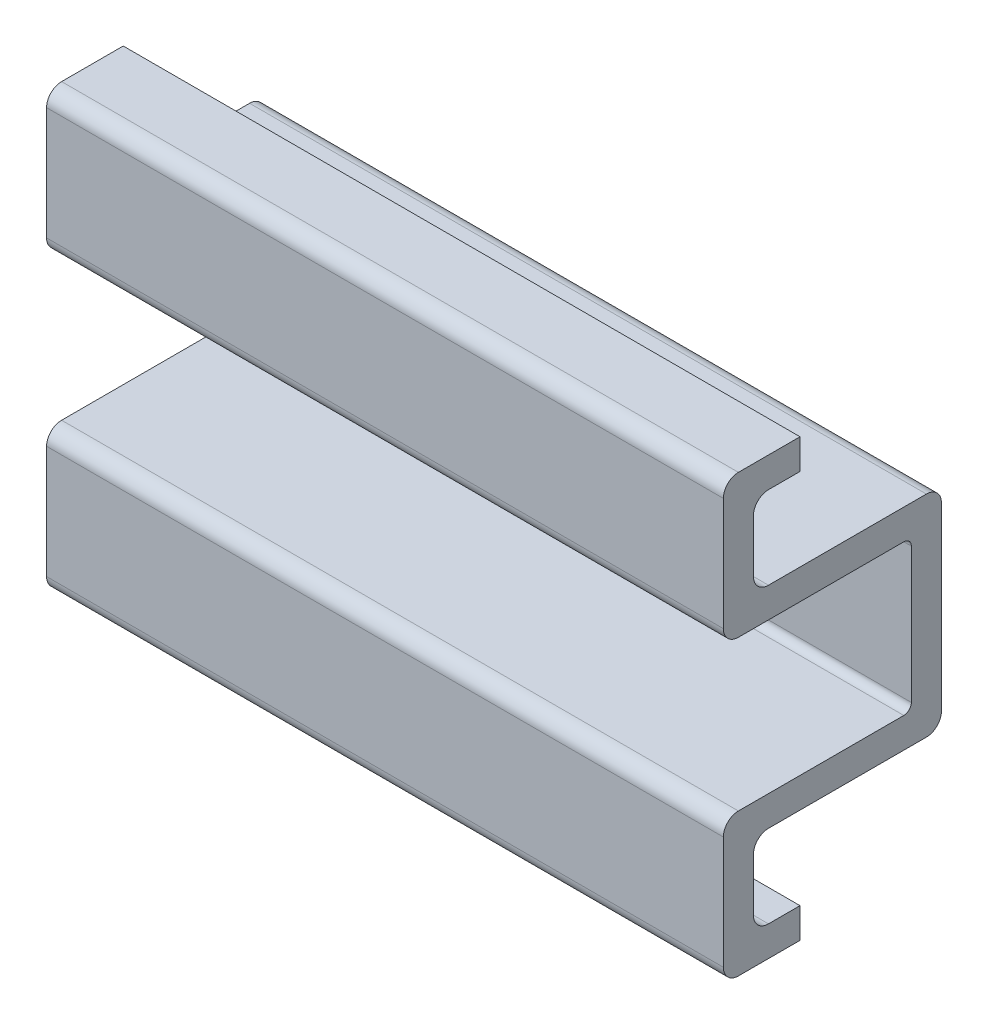
ISO-10303-21;
HEADER;
FILE_DESCRIPTION(('STEP AP214'),'2;1');
FILE_NAME('part.step','',(''),(''),'','','');
FILE_SCHEMA(('AUTOMOTIVE_DESIGN { 1 0 10303 214 1 1 1 1 }'));
ENDSEC;
DATA;
#1=APPLICATION_CONTEXT('core data for automotive mechanical design processes');
#2=APPLICATION_PROTOCOL_DEFINITION('international standard','automotive_design',2000,#1);
#3=PRODUCT_CONTEXT('',#1,'mechanical');
#4=PRODUCT('Part','Part','',(#3));
#5=PRODUCT_RELATED_PRODUCT_CATEGORY('part','',(#4));
#6=PRODUCT_DEFINITION_FORMATION('','',#4);
#7=PRODUCT_DEFINITION_CONTEXT('part definition',#1,'design');
#8=PRODUCT_DEFINITION('design','',#6,#7);
#9=PRODUCT_DEFINITION_SHAPE('','',#8);
#10=(LENGTH_UNIT() NAMED_UNIT(*) SI_UNIT(.MILLI.,.METRE.));
#11=(NAMED_UNIT(*) PLANE_ANGLE_UNIT() SI_UNIT($,.RADIAN.));
#12=(NAMED_UNIT(*) SI_UNIT($,.STERADIAN.) SOLID_ANGLE_UNIT());
#13=UNCERTAINTY_MEASURE_WITH_UNIT(LENGTH_MEASURE(1.E-05),#10,'distance_accuracy_value','');
#14=(GEOMETRIC_REPRESENTATION_CONTEXT(3) GLOBAL_UNCERTAINTY_ASSIGNED_CONTEXT((#13)) GLOBAL_UNIT_ASSIGNED_CONTEXT((#10,
#11,#12)) REPRESENTATION_CONTEXT('',''));
#15=CARTESIAN_POINT('',(0.,0.,0.));
#16=DIRECTION('',(0.,0.,1.));
#17=DIRECTION('',(1.,0.,0.));
#18=AXIS2_PLACEMENT_3D('',#15,#16,#17);
#19=CARTESIAN_POINT('',(45.,0.,13.1316966964459));
#20=DIRECTION('',(0.,0.,1.));
#21=DIRECTION('',(1.,0.,0.));
#22=AXIS2_PLACEMENT_3D('',#19,#20,#21);
#23=PLANE('',#22);
#24=DIRECTION('',(0.,1.,0.));
#25=VECTOR('',#24,1.);
#26=CARTESIAN_POINT('',(0.,0.,13.1316966964459));
#27=LINE('',#26,#25);
#28=CARTESIAN_POINT('',(0.,-14.5,13.1316966964459));
#29=VERTEX_POINT('',#28);
#30=CARTESIAN_POINT('',(0.,-12.5,13.1316966964459));
#31=VERTEX_POINT('',#30);
#32=EDGE_CURVE('E248',#29,#31,#27,.T.);
#33=ORIENTED_EDGE('',*,*,#32,.T.);
#34=DIRECTION('',(-1.,0.,0.));
#35=VECTOR('',#34,1.);
#36=CARTESIAN_POINT('',(45.,-12.5,13.1316966964459));
#37=LINE('',#36,#35);
#38=CARTESIAN_POINT('',(45.,-12.5,13.1316966964459));
#39=VERTEX_POINT('',#38);
#40=EDGE_CURVE('E229',#39,#31,#37,.T.);
#41=ORIENTED_EDGE('',*,*,#40,.F.);
#42=DIRECTION('',(0.,1.,0.));
#43=VECTOR('',#42,1.);
#44=CARTESIAN_POINT('',(45.,0.,13.1316966964459));
#45=LINE('',#44,#43);
#46=CARTESIAN_POINT('',(45.,-14.5,13.1316966964459));
#47=VERTEX_POINT('',#46);
#48=EDGE_CURVE('E235',#47,#39,#45,.T.);
#49=ORIENTED_EDGE('',*,*,#48,.F.);
#50=DIRECTION('',(-1.,0.,0.));
#51=VECTOR('',#50,1.);
#52=CARTESIAN_POINT('',(45.,-14.5,13.1316966964459));
#53=LINE('',#52,#51);
#54=EDGE_CURVE('E387',#47,#29,#53,.T.);
#55=ORIENTED_EDGE('',*,*,#54,.T.);
#56=EDGE_LOOP('',(#33,#41,#49,#55));
#57=FACE_BOUND('',#56,.T.);
#58=ADVANCED_FACE('F40',(#57),#23,.F.);
#59=CARTESIAN_POINT('',(45.,-12.5,0.));
#60=DIRECTION('',(0.,-1.,0.));
#61=DIRECTION('',(0.,0.,-1.));
#62=AXIS2_PLACEMENT_3D('',#59,#60,#61);
#63=PLANE('',#62);
#64=DIRECTION('',(0.,0.,1.));
#65=VECTOR('',#64,1.);
#66=CARTESIAN_POINT('',(0.,-12.5,0.));
#67=LINE('',#66,#65);
#68=CARTESIAN_POINT('',(0.,-12.5,15.2292675484302));
#69=VERTEX_POINT('',#68);
#70=EDGE_CURVE('E389',#31,#69,#67,.T.);
#71=ORIENTED_EDGE('',*,*,#70,.T.);
#72=DIRECTION('',(-1.,0.,0.));
#73=VECTOR('',#72,1.);
#74=CARTESIAN_POINT('',(45.,-12.5,15.2292675484302));
#75=LINE('',#74,#73);
#76=CARTESIAN_POINT('',(45.,-12.5,15.2292675484302));
#77=VERTEX_POINT('',#76);
#78=EDGE_CURVE('E232',#69,#77,#75,.F.);
#79=ORIENTED_EDGE('',*,*,#78,.T.);
#80=DIRECTION('',(0.,0.,1.));
#81=VECTOR('',#80,1.);
#82=CARTESIAN_POINT('',(45.,-12.5,0.));
#83=LINE('',#82,#81);
#84=EDGE_CURVE('E224',#39,#77,#83,.T.);
#85=ORIENTED_EDGE('',*,*,#84,.F.);
#86=ORIENTED_EDGE('',*,*,#40,.T.);
#87=EDGE_LOOP('',(#71,#79,#85,#86));
#88=FACE_BOUND('',#87,.T.);
#89=ADVANCED_FACE('F227',(#88),#63,.F.);
#90=CARTESIAN_POINT('',(45.,0.,16.2292675484302));
#91=DIRECTION('',(0.,0.,-1.));
#92=DIRECTION('',(-1.,0.,0.));
#93=AXIS2_PLACEMENT_3D('',#90,#91,#92);
#94=PLANE('',#93);
#95=DIRECTION('',(0.,-1.,0.));
#96=VECTOR('',#95,1.);
#97=CARTESIAN_POINT('',(45.,0.,16.2292675484302));
#98=LINE('',#97,#96);
#99=CARTESIAN_POINT('',(45.,-8.,16.2292675484302));
#100=VERTEX_POINT('',#99);
#101=CARTESIAN_POINT('',(45.,-11.5,16.2292675484302));
#102=VERTEX_POINT('',#101);
#103=EDGE_CURVE('E234',#100,#102,#98,.T.);
#104=ORIENTED_EDGE('',*,*,#103,.T.);
#105=DIRECTION('',(-1.,0.,0.));
#106=VECTOR('',#105,1.);
#107=CARTESIAN_POINT('',(45.,-11.5,16.2292675484302));
#108=LINE('',#107,#106);
#109=CARTESIAN_POINT('',(0.,-11.5,16.2292675484302));
#110=VERTEX_POINT('',#109);
#111=EDGE_CURVE('E312',#102,#110,#108,.T.);
#112=ORIENTED_EDGE('',*,*,#111,.T.);
#113=DIRECTION('',(0.,-1.,0.));
#114=VECTOR('',#113,1.);
#115=CARTESIAN_POINT('',(0.,0.,16.2292675484302));
#116=LINE('',#115,#114);
#117=CARTESIAN_POINT('',(0.,-8.,16.2292675484302));
#118=VERTEX_POINT('',#117);
#119=EDGE_CURVE('E391',#118,#110,#116,.T.);
#120=ORIENTED_EDGE('',*,*,#119,.F.);
#121=DIRECTION('',(-1.,0.,0.));
#122=VECTOR('',#121,1.);
#123=CARTESIAN_POINT('',(45.,-8.,16.2292675484302));
#124=LINE('',#123,#122);
#125=EDGE_CURVE('E310',#118,#100,#124,.F.);
#126=ORIENTED_EDGE('',*,*,#125,.T.);
#127=EDGE_LOOP('',(#104,#112,#120,#126));
#128=FACE_BOUND('',#127,.T.);
#129=ADVANCED_FACE('F472',(#128),#94,.T.);
#130=CARTESIAN_POINT('',(45.,-7.,0.));
#131=DIRECTION('',(0.,-1.,0.));
#132=DIRECTION('',(0.,0.,-1.));
#133=AXIS2_PLACEMENT_3D('',#130,#131,#132);
#134=PLANE('',#133);
#135=DIRECTION('',(0.,0.,1.));
#136=VECTOR('',#135,1.);
#137=CARTESIAN_POINT('',(45.,-7.,0.));
#138=LINE('',#137,#136);
#139=CARTESIAN_POINT('',(45.,-7.,4.72926754843017));
#140=VERTEX_POINT('',#139);
#141=CARTESIAN_POINT('',(45.,-7.,15.2292675484302));
#142=VERTEX_POINT('',#141);
#143=EDGE_CURVE('E465',#140,#142,#138,.T.);
#144=ORIENTED_EDGE('',*,*,#143,.T.);
#145=DIRECTION('',(-1.,0.,0.));
#146=VECTOR('',#145,1.);
#147=CARTESIAN_POINT('',(0.,-7.,15.2292675484302));
#148=LINE('',#147,#146);
#149=CARTESIAN_POINT('',(0.,-7.,15.2292675484302));
#150=VERTEX_POINT('',#149);
#151=EDGE_CURVE('E318',#142,#150,#148,.T.);
#152=ORIENTED_EDGE('',*,*,#151,.T.);
#153=DIRECTION('',(0.,0.,1.));
#154=VECTOR('',#153,1.);
#155=CARTESIAN_POINT('',(0.,-7.,0.));
#156=LINE('',#155,#154);
#157=CARTESIAN_POINT('',(0.,-7.,4.72926754843017));
#158=VERTEX_POINT('',#157);
#159=EDGE_CURVE('E394',#158,#150,#156,.T.);
#160=ORIENTED_EDGE('',*,*,#159,.F.);
#161=DIRECTION('',(-1.,0.,0.));
#162=VECTOR('',#161,1.);
#163=CARTESIAN_POINT('',(45.,-7.,4.72926754843017));
#164=LINE('',#163,#162);
#165=EDGE_CURVE('E316',#158,#140,#164,.F.);
#166=ORIENTED_EDGE('',*,*,#165,.T.);
#167=EDGE_LOOP('',(#144,#152,#160,#166));
#168=FACE_BOUND('',#167,.T.);
#169=ADVANCED_FACE('F484',(#168),#134,.T.);
#170=CARTESIAN_POINT('',(45.,0.,3.72926754843018));
#171=DIRECTION('',(0.,0.,-1.));
#172=DIRECTION('',(0.,1.,0.));
#173=AXIS2_PLACEMENT_3D('',#170,#171,#172);
#174=PLANE('',#173);
#175=DIRECTION('',(0.,-1.,0.));
#176=VECTOR('',#175,1.);
#177=CARTESIAN_POINT('',(0.,0.,3.72926754843018));
#178=LINE('',#177,#176);
#179=CARTESIAN_POINT('',(0.,6.,3.72926754843018));
#180=VERTEX_POINT('',#179);
#181=CARTESIAN_POINT('',(0.,-6.,3.72926754843017));
#182=VERTEX_POINT('',#181);
#183=EDGE_CURVE('E397',#180,#182,#178,.T.);
#184=ORIENTED_EDGE('',*,*,#183,.F.);
#185=DIRECTION('',(-1.,0.,0.));
#186=VECTOR('',#185,1.);
#187=CARTESIAN_POINT('',(45.,6.,3.72926754843018));
#188=LINE('',#187,#186);
#189=CARTESIAN_POINT('',(45.,6.,3.72926754843018));
#190=VERTEX_POINT('',#189);
#191=EDGE_CURVE('E329',#180,#190,#188,.F.);
#192=ORIENTED_EDGE('',*,*,#191,.T.);
#193=DIRECTION('',(0.,-1.,0.));
#194=VECTOR('',#193,1.);
#195=CARTESIAN_POINT('',(45.,0.,3.72926754843018));
#196=LINE('',#195,#194);
#197=CARTESIAN_POINT('',(45.,-6.,3.72926754843017));
#198=VERTEX_POINT('',#197);
#199=EDGE_CURVE('E462',#190,#198,#196,.T.);
#200=ORIENTED_EDGE('',*,*,#199,.T.);
#201=DIRECTION('',(-1.,0.,0.));
#202=VECTOR('',#201,1.);
#203=CARTESIAN_POINT('',(45.,-6.,3.72926754843017));
#204=LINE('',#203,#202);
#205=EDGE_CURVE('E326',#198,#182,#204,.T.);
#206=ORIENTED_EDGE('',*,*,#205,.T.);
#207=EDGE_LOOP('',(#184,#192,#200,#206));
#208=FACE_BOUND('',#207,.T.);
#209=ADVANCED_FACE('F494',(#208),#174,.T.);
#210=CARTESIAN_POINT('',(45.,7.,0.));
#211=DIRECTION('',(0.,-1.,0.));
#212=DIRECTION('',(0.,0.,-1.));
#213=AXIS2_PLACEMENT_3D('',#210,#211,#212);
#214=PLANE('',#213);
#215=DIRECTION('',(0.,0.,1.));
#216=VECTOR('',#215,1.);
#217=CARTESIAN_POINT('',(0.,7.,0.));
#218=LINE('',#217,#216);
#219=CARTESIAN_POINT('',(0.,7.,4.72926754843018));
#220=VERTEX_POINT('',#219);
#221=CARTESIAN_POINT('',(0.,7.,15.2292675484302));
#222=VERTEX_POINT('',#221);
#223=EDGE_CURVE('E400',#220,#222,#218,.T.);
#224=ORIENTED_EDGE('',*,*,#223,.T.);
#225=DIRECTION('',(-1.,0.,0.));
#226=VECTOR('',#225,1.);
#227=CARTESIAN_POINT('',(45.,7.,15.2292675484302));
#228=LINE('',#227,#226);
#229=CARTESIAN_POINT('',(45.,7.,15.2292675484302));
#230=VERTEX_POINT('',#229);
#231=EDGE_CURVE('E324',#222,#230,#228,.F.);
#232=ORIENTED_EDGE('',*,*,#231,.T.);
#233=DIRECTION('',(0.,0.,1.));
#234=VECTOR('',#233,1.);
#235=CARTESIAN_POINT('',(45.,7.,0.));
#236=LINE('',#235,#234);
#237=CARTESIAN_POINT('',(45.,7.,4.72926754843018));
#238=VERTEX_POINT('',#237);
#239=EDGE_CURVE('E459',#238,#230,#236,.T.);
#240=ORIENTED_EDGE('',*,*,#239,.F.);
#241=DIRECTION('',(-1.,0.,0.));
#242=VECTOR('',#241,1.);
#243=CARTESIAN_POINT('',(0.,7.,4.72926754843018));
#244=LINE('',#243,#242);
#245=EDGE_CURVE('E321',#238,#220,#244,.T.);
#246=ORIENTED_EDGE('',*,*,#245,.T.);
#247=EDGE_LOOP('',(#224,#232,#240,#246));
#248=FACE_BOUND('',#247,.T.);
#249=ADVANCED_FACE('F502',(#248),#214,.F.);
#250=CARTESIAN_POINT('',(45.,0.,16.2292675484302));
#251=DIRECTION('',(0.,0.,1.));
#252=DIRECTION('',(1.,0.,0.));
#253=AXIS2_PLACEMENT_3D('',#250,#251,#252);
#254=PLANE('',#253);
#255=DIRECTION('',(0.,1.,0.));
#256=VECTOR('',#255,1.);
#257=CARTESIAN_POINT('',(0.,0.,16.2292675484302));
#258=LINE('',#257,#256);
#259=CARTESIAN_POINT('',(0.,8.,16.2292675484302));
#260=VERTEX_POINT('',#259);
#261=CARTESIAN_POINT('',(0.,11.5,16.2292675484302));
#262=VERTEX_POINT('',#261);
#263=EDGE_CURVE('E403',#260,#262,#258,.T.);
#264=ORIENTED_EDGE('',*,*,#263,.T.);
#265=DIRECTION('',(-1.,0.,0.));
#266=VECTOR('',#265,1.);
#267=CARTESIAN_POINT('',(45.,11.5,16.2292675484302));
#268=LINE('',#267,#266);
#269=CARTESIAN_POINT('',(45.,11.5,16.2292675484302));
#270=VERTEX_POINT('',#269);
#271=EDGE_CURVE('E308',#262,#270,#268,.F.);
#272=ORIENTED_EDGE('',*,*,#271,.T.);
#273=DIRECTION('',(0.,1.,0.));
#274=VECTOR('',#273,1.);
#275=CARTESIAN_POINT('',(45.,0.,16.2292675484302));
#276=LINE('',#275,#274);
#277=CARTESIAN_POINT('',(45.,8.,16.2292675484302));
#278=VERTEX_POINT('',#277);
#279=EDGE_CURVE('E456',#278,#270,#276,.T.);
#280=ORIENTED_EDGE('',*,*,#279,.F.);
#281=DIRECTION('',(-1.,0.,0.));
#282=VECTOR('',#281,1.);
#283=CARTESIAN_POINT('',(0.,8.,16.2292675484302));
#284=LINE('',#283,#282);
#285=EDGE_CURVE('E305',#278,#260,#284,.T.);
#286=ORIENTED_EDGE('',*,*,#285,.T.);
#287=EDGE_LOOP('',(#264,#272,#280,#286));
#288=FACE_BOUND('',#287,.T.);
#289=ADVANCED_FACE('F511',(#288),#254,.F.);
#290=CARTESIAN_POINT('',(45.,12.5,0.));
#291=DIRECTION('',(0.,-1.,0.));
#292=DIRECTION('',(0.,0.,-1.));
#293=AXIS2_PLACEMENT_3D('',#290,#291,#292);
#294=PLANE('',#293);
#295=DIRECTION('',(0.,0.,1.));
#296=VECTOR('',#295,1.);
#297=CARTESIAN_POINT('',(45.,12.5,0.));
#298=LINE('',#297,#296);
#299=CARTESIAN_POINT('',(45.,12.5,13.1316966964459));
#300=VERTEX_POINT('',#299);
#301=CARTESIAN_POINT('',(45.,12.5,15.2292675484302));
#302=VERTEX_POINT('',#301);
#303=EDGE_CURVE('E453',#300,#302,#298,.T.);
#304=ORIENTED_EDGE('',*,*,#303,.T.);
#305=DIRECTION('',(-1.,0.,0.));
#306=VECTOR('',#305,1.);
#307=CARTESIAN_POINT('',(45.,12.5,15.2292675484302));
#308=LINE('',#307,#306);
#309=CARTESIAN_POINT('',(0.,12.5,15.2292675484302));
#310=VERTEX_POINT('',#309);
#311=EDGE_CURVE('E302',#302,#310,#308,.T.);
#312=ORIENTED_EDGE('',*,*,#311,.T.);
#313=DIRECTION('',(0.,0.,1.));
#314=VECTOR('',#313,1.);
#315=CARTESIAN_POINT('',(0.,12.5,0.));
#316=LINE('',#315,#314);
#317=CARTESIAN_POINT('',(0.,12.5,13.1316966964459));
#318=VERTEX_POINT('',#317);
#319=EDGE_CURVE('E406',#318,#310,#316,.T.);
#320=ORIENTED_EDGE('',*,*,#319,.F.);
#321=DIRECTION('',(-1.,0.,0.));
#322=VECTOR('',#321,1.);
#323=CARTESIAN_POINT('',(45.,12.5,13.1316966964459));
#324=LINE('',#323,#322);
#325=EDGE_CURVE('E250',#300,#318,#324,.T.);
#326=ORIENTED_EDGE('',*,*,#325,.F.);
#327=EDGE_LOOP('',(#304,#312,#320,#326));
#328=FACE_BOUND('',#327,.T.);
#329=ADVANCED_FACE('F519',(#328),#294,.T.);
#330=CARTESIAN_POINT('',(45.,0.,13.1316966964459));
#331=DIRECTION('',(0.,0.,-1.));
#332=DIRECTION('',(-1.,0.,0.));
#333=AXIS2_PLACEMENT_3D('',#330,#331,#332);
#334=PLANE('',#333);
#335=DIRECTION('',(0.,-1.,0.));
#336=VECTOR('',#335,1.);
#337=CARTESIAN_POINT('',(0.,0.,13.1316966964459));
#338=LINE('',#337,#336);
#339=CARTESIAN_POINT('',(0.,14.5,13.1316966964459));
#340=VERTEX_POINT('',#339);
#341=EDGE_CURVE('E409',#340,#318,#338,.T.);
#342=ORIENTED_EDGE('',*,*,#341,.F.);
#343=DIRECTION('',(-1.,0.,0.));
#344=VECTOR('',#343,1.);
#345=CARTESIAN_POINT('',(45.,14.5,13.1316966964459));
#346=LINE('',#345,#344);
#347=CARTESIAN_POINT('',(45.,14.5,13.1316966964459));
#348=VERTEX_POINT('',#347);
#349=EDGE_CURVE('E255',#348,#340,#346,.T.);
#350=ORIENTED_EDGE('',*,*,#349,.F.);
#351=DIRECTION('',(0.,-1.,0.));
#352=VECTOR('',#351,1.);
#353=CARTESIAN_POINT('',(45.,0.,13.1316966964459));
#354=LINE('',#353,#352);
#355=EDGE_CURVE('E449',#348,#300,#354,.T.);
#356=ORIENTED_EDGE('',*,*,#355,.T.);
#357=ORIENTED_EDGE('',*,*,#325,.T.);
#358=EDGE_LOOP('',(#342,#350,#356,#357));
#359=FACE_BOUND('',#358,.T.);
#360=ADVANCED_FACE('F435',(#359),#334,.T.);
#361=CARTESIAN_POINT('',(45.,14.5,0.));
#362=DIRECTION('',(0.,1.,0.));
#363=DIRECTION('',(0.,0.,1.));
#364=AXIS2_PLACEMENT_3D('',#361,#362,#363);
#365=PLANE('',#364);
#366=DIRECTION('',(0.,0.,-1.));
#367=VECTOR('',#366,1.);
#368=CARTESIAN_POINT('',(0.,14.5,0.));
#369=LINE('',#368,#367);
#370=CARTESIAN_POINT('',(0.,14.5,17.2292675484302));
#371=VERTEX_POINT('',#370);
#372=EDGE_CURVE('E412',#371,#340,#369,.T.);
#373=ORIENTED_EDGE('',*,*,#372,.F.);
#374=DIRECTION('',(-1.,0.,0.));
#375=VECTOR('',#374,1.);
#376=CARTESIAN_POINT('',(45.,14.5,17.2292675484302));
#377=LINE('',#376,#375);
#378=CARTESIAN_POINT('',(45.,14.5,17.2292675484302));
#379=VERTEX_POINT('',#378);
#380=EDGE_CURVE('E300',#371,#379,#377,.F.);
#381=ORIENTED_EDGE('',*,*,#380,.T.);
#382=DIRECTION('',(0.,0.,-1.));
#383=VECTOR('',#382,1.);
#384=CARTESIAN_POINT('',(45.,14.5,0.));
#385=LINE('',#384,#383);
#386=EDGE_CURVE('E431',#379,#348,#385,.T.);
#387=ORIENTED_EDGE('',*,*,#386,.T.);
#388=ORIENTED_EDGE('',*,*,#349,.T.);
#389=EDGE_LOOP('',(#373,#381,#387,#388));
#390=FACE_BOUND('',#389,.T.);
#391=ADVANCED_FACE('F428',(#390),#365,.T.);
#392=CARTESIAN_POINT('',(45.,0.,18.2292675484302));
#393=DIRECTION('',(0.,0.,1.));
#394=DIRECTION('',(1.,0.,0.));
#395=AXIS2_PLACEMENT_3D('',#392,#393,#394);
#396=PLANE('',#395);
#397=DIRECTION('',(0.,1.,0.));
#398=VECTOR('',#397,1.);
#399=CARTESIAN_POINT('',(0.,0.,18.2292675484302));
#400=LINE('',#399,#398);
#401=CARTESIAN_POINT('',(0.,6.,18.2292675484302));
#402=VERTEX_POINT('',#401);
#403=CARTESIAN_POINT('',(0.,13.5,18.2292675484302));
#404=VERTEX_POINT('',#403);
#405=EDGE_CURVE('E414',#402,#404,#400,.T.);
#406=ORIENTED_EDGE('',*,*,#405,.F.);
#407=DIRECTION('',(-1.,0.,0.));
#408=VECTOR('',#407,1.);
#409=CARTESIAN_POINT('',(45.,6.,18.2292675484302));
#410=LINE('',#409,#408);
#411=CARTESIAN_POINT('',(45.,6.,18.2292675484302));
#412=VERTEX_POINT('',#411);
#413=EDGE_CURVE('E274',#402,#412,#410,.F.);
#414=ORIENTED_EDGE('',*,*,#413,.T.);
#415=DIRECTION('',(0.,1.,0.));
#416=VECTOR('',#415,1.);
#417=CARTESIAN_POINT('',(45.,0.,18.2292675484302));
#418=LINE('',#417,#416);
#419=CARTESIAN_POINT('',(45.,13.5,18.2292675484302));
#420=VERTEX_POINT('',#419);
#421=EDGE_CURVE('E446',#412,#420,#418,.T.);
#422=ORIENTED_EDGE('',*,*,#421,.T.);
#423=DIRECTION('',(-1.,0.,0.));
#424=VECTOR('',#423,1.);
#425=CARTESIAN_POINT('',(45.,13.5,18.2292675484302));
#426=LINE('',#425,#424);
#427=EDGE_CURVE('E271',#420,#404,#426,.T.);
#428=ORIENTED_EDGE('',*,*,#427,.T.);
#429=EDGE_LOOP('',(#406,#414,#422,#428));
#430=FACE_BOUND('',#429,.T.);
#431=ADVANCED_FACE('F444',(#430),#396,.T.);
#432=CARTESIAN_POINT('',(45.,5.,0.));
#433=DIRECTION('',(0.,-1.,0.));
#434=DIRECTION('',(0.,0.,-1.));
#435=AXIS2_PLACEMENT_3D('',#432,#433,#434);
#436=PLANE('',#435);
#437=DIRECTION('',(0.,0.,1.));
#438=VECTOR('',#437,1.);
#439=CARTESIAN_POINT('',(0.,5.,0.));
#440=LINE('',#439,#438);
#441=CARTESIAN_POINT('',(0.,5.,6.22926754843018));
#442=VERTEX_POINT('',#441);
#443=CARTESIAN_POINT('',(0.,5.,17.2292675484302));
#444=VERTEX_POINT('',#443);
#445=EDGE_CURVE('E370',#442,#444,#440,.T.);
#446=ORIENTED_EDGE('',*,*,#445,.F.);
#447=DIRECTION('',(-1.,0.,0.));
#448=VECTOR('',#447,1.);
#449=CARTESIAN_POINT('',(45.,5.,6.22926754843018));
#450=LINE('',#449,#448);
#451=CARTESIAN_POINT('',(45.,5.,6.22926754843018));
#452=VERTEX_POINT('',#451);
#453=EDGE_CURVE('E352',#442,#452,#450,.F.);
#454=ORIENTED_EDGE('',*,*,#453,.T.);
#455=DIRECTION('',(0.,0.,1.));
#456=VECTOR('',#455,1.);
#457=CARTESIAN_POINT('',(45.,5.,0.));
#458=LINE('',#457,#456);
#459=CARTESIAN_POINT('',(45.,5.,17.2292675484302));
#460=VERTEX_POINT('',#459);
#461=EDGE_CURVE('E382',#452,#460,#458,.T.);
#462=ORIENTED_EDGE('',*,*,#461,.T.);
#463=DIRECTION('',(-1.,0.,0.));
#464=VECTOR('',#463,1.);
#465=CARTESIAN_POINT('',(45.,5.,17.2292675484302));
#466=LINE('',#465,#464);
#467=EDGE_CURVE('E249',#460,#444,#466,.T.);
#468=ORIENTED_EDGE('',*,*,#467,.T.);
#469=EDGE_LOOP('',(#446,#454,#462,#468));
#470=FACE_BOUND('',#469,.T.);
#471=ADVANCED_FACE('F575',(#470),#436,.T.);
#472=CARTESIAN_POINT('',(45.,0.,5.72926754843018));
#473=DIRECTION('',(0.,0.,-1.));
#474=DIRECTION('',(0.,1.,0.));
#475=AXIS2_PLACEMENT_3D('',#472,#473,#474);
#476=PLANE('',#475);
#477=DIRECTION('',(0.,-1.,0.));
#478=VECTOR('',#477,1.);
#479=CARTESIAN_POINT('',(45.,0.,5.72926754843018));
#480=LINE('',#479,#478);
#481=CARTESIAN_POINT('',(45.,4.5,5.72926754843018));
#482=VERTEX_POINT('',#481);
#483=CARTESIAN_POINT('',(45.,-4.5,5.72926754843017));
#484=VERTEX_POINT('',#483);
#485=EDGE_CURVE('E378',#482,#484,#480,.T.);
#486=ORIENTED_EDGE('',*,*,#485,.F.);
#487=DIRECTION('',(-1.,0.,0.));
#488=VECTOR('',#487,1.);
#489=CARTESIAN_POINT('',(45.,4.5,5.72926754843018));
#490=LINE('',#489,#488);
#491=CARTESIAN_POINT('',(0.,4.5,5.72926754843018));
#492=VERTEX_POINT('',#491);
#493=EDGE_CURVE('E349',#482,#492,#490,.T.);
#494=ORIENTED_EDGE('',*,*,#493,.T.);
#495=DIRECTION('',(0.,-1.,0.));
#496=VECTOR('',#495,1.);
#497=CARTESIAN_POINT('',(0.,0.,5.72926754843018));
#498=LINE('',#497,#496);
#499=CARTESIAN_POINT('',(0.,-4.5,5.72926754843017));
#500=VERTEX_POINT('',#499);
#501=EDGE_CURVE('E364',#492,#500,#498,.T.);
#502=ORIENTED_EDGE('',*,*,#501,.T.);
#503=DIRECTION('',(-1.,0.,0.));
#504=VECTOR('',#503,1.);
#505=CARTESIAN_POINT('',(45.,-4.5,5.72926754843017));
#506=LINE('',#505,#504);
#507=EDGE_CURVE('E347',#500,#484,#506,.F.);
#508=ORIENTED_EDGE('',*,*,#507,.T.);
#509=EDGE_LOOP('',(#486,#494,#502,#508));
#510=FACE_BOUND('',#509,.T.);
#511=ADVANCED_FACE('F368',(#510),#476,.F.);
#512=CARTESIAN_POINT('',(45.,-5.,0.));
#513=DIRECTION('',(0.,-1.,0.));
#514=DIRECTION('',(0.,0.,-1.));
#515=AXIS2_PLACEMENT_3D('',#512,#513,#514);
#516=PLANE('',#515);
#517=DIRECTION('',(0.,0.,1.));
#518=VECTOR('',#517,1.);
#519=CARTESIAN_POINT('',(45.,-5.,0.));
#520=LINE('',#519,#518);
#521=CARTESIAN_POINT('',(45.,-5.,6.22926754843017));
#522=VERTEX_POINT('',#521);
#523=CARTESIAN_POINT('',(45.,-5.,17.2292675484302));
#524=VERTEX_POINT('',#523);
#525=EDGE_CURVE('E374',#522,#524,#520,.T.);
#526=ORIENTED_EDGE('',*,*,#525,.F.);
#527=DIRECTION('',(-1.,0.,0.));
#528=VECTOR('',#527,1.);
#529=CARTESIAN_POINT('',(0.,-5.,6.22926754843017));
#530=LINE('',#529,#528);
#531=CARTESIAN_POINT('',(0.,-5.,6.22926754843017));
#532=VERTEX_POINT('',#531);
#533=EDGE_CURVE('E354',#522,#532,#530,.T.);
#534=ORIENTED_EDGE('',*,*,#533,.T.);
#535=DIRECTION('',(0.,0.,1.));
#536=VECTOR('',#535,1.);
#537=CARTESIAN_POINT('',(0.,-5.,0.));
#538=LINE('',#537,#536);
#539=CARTESIAN_POINT('',(0.,-5.,17.2292675484302));
#540=VERTEX_POINT('',#539);
#541=EDGE_CURVE('E365',#532,#540,#538,.T.);
#542=ORIENTED_EDGE('',*,*,#541,.T.);
#543=DIRECTION('',(-1.,0.,0.));
#544=VECTOR('',#543,1.);
#545=CARTESIAN_POINT('',(45.,-5.,17.2292675484302));
#546=LINE('',#545,#544);
#547=EDGE_CURVE('E294',#540,#524,#546,.F.);
#548=ORIENTED_EDGE('',*,*,#547,.T.);
#549=EDGE_LOOP('',(#526,#534,#542,#548));
#550=FACE_BOUND('',#549,.T.);
#551=ADVANCED_FACE('F373',(#550),#516,.F.);
#552=CARTESIAN_POINT('',(45.,0.,18.2292675484302));
#553=DIRECTION('',(0.,0.,-1.));
#554=DIRECTION('',(-1.,0.,0.));
#555=AXIS2_PLACEMENT_3D('',#552,#553,#554);
#556=PLANE('',#555);
#557=DIRECTION('',(0.,-1.,0.));
#558=VECTOR('',#557,1.);
#559=CARTESIAN_POINT('',(45.,0.,18.2292675484302));
#560=LINE('',#559,#558);
#561=CARTESIAN_POINT('',(45.,-6.,18.2292675484302));
#562=VERTEX_POINT('',#561);
#563=CARTESIAN_POINT('',(45.,-13.5,18.2292675484302));
#564=VERTEX_POINT('',#563);
#565=EDGE_CURVE('E377',#562,#564,#560,.T.);
#566=ORIENTED_EDGE('',*,*,#565,.F.);
#567=DIRECTION('',(-1.,0.,0.));
#568=VECTOR('',#567,1.);
#569=CARTESIAN_POINT('',(45.,-6.,18.2292675484302));
#570=LINE('',#569,#568);
#571=CARTESIAN_POINT('',(0.,-6.,18.2292675484302));
#572=VERTEX_POINT('',#571);
#573=EDGE_CURVE('E291',#562,#572,#570,.T.);
#574=ORIENTED_EDGE('',*,*,#573,.T.);
#575=DIRECTION('',(0.,-1.,0.));
#576=VECTOR('',#575,1.);
#577=CARTESIAN_POINT('',(0.,0.,18.2292675484302));
#578=LINE('',#577,#576);
#579=CARTESIAN_POINT('',(0.,-13.5,18.2292675484302));
#580=VERTEX_POINT('',#579);
#581=EDGE_CURVE('E419',#572,#580,#578,.T.);
#582=ORIENTED_EDGE('',*,*,#581,.T.);
#583=DIRECTION('',(-1.,0.,0.));
#584=VECTOR('',#583,1.);
#585=CARTESIAN_POINT('',(45.,-13.5,18.2292675484302));
#586=LINE('',#585,#584);
#587=EDGE_CURVE('E289',#580,#564,#586,.F.);
#588=ORIENTED_EDGE('',*,*,#587,.T.);
#589=EDGE_LOOP('',(#566,#574,#582,#588));
#590=FACE_BOUND('',#589,.T.);
#591=ADVANCED_FACE('F597',(#590),#556,.F.);
#592=CARTESIAN_POINT('',(45.,-14.5,0.));
#593=DIRECTION('',(0.,1.,0.));
#594=DIRECTION('',(0.,0.,1.));
#595=AXIS2_PLACEMENT_3D('',#592,#593,#594);
#596=PLANE('',#595);
#597=DIRECTION('',(0.,0.,-1.));
#598=VECTOR('',#597,1.);
#599=CARTESIAN_POINT('',(45.,-14.5,0.));
#600=LINE('',#599,#598);
#601=CARTESIAN_POINT('',(45.,-14.5,17.2292675484302));
#602=VERTEX_POINT('',#601);
#603=EDGE_CURVE('E241',#602,#47,#600,.T.);
#604=ORIENTED_EDGE('',*,*,#603,.F.);
#605=DIRECTION('',(-1.,0.,0.));
#606=VECTOR('',#605,1.);
#607=CARTESIAN_POINT('',(45.,-14.5,17.2292675484302));
#608=LINE('',#607,#606);
#609=CARTESIAN_POINT('',(0.,-14.5,17.2292675484302));
#610=VERTEX_POINT('',#609);
#611=EDGE_CURVE('E297',#602,#610,#608,.T.);
#612=ORIENTED_EDGE('',*,*,#611,.T.);
#613=DIRECTION('',(0.,0.,-1.));
#614=VECTOR('',#613,1.);
#615=CARTESIAN_POINT('',(0.,-14.5,0.));
#616=LINE('',#615,#614);
#617=EDGE_CURVE('E245',#610,#29,#616,.T.);
#618=ORIENTED_EDGE('',*,*,#617,.T.);
#619=ORIENTED_EDGE('',*,*,#54,.F.);
#620=EDGE_LOOP('',(#604,#612,#618,#619));
#621=FACE_BOUND('',#620,.T.);
#622=ADVANCED_FACE('F601',(#621),#596,.F.);
#623=CARTESIAN_POINT('',(45.,0.,0.));
#624=DIRECTION('',(1.,0.,0.));
#625=DIRECTION('',(0.,0.,-1.));
#626=AXIS2_PLACEMENT_3D('',#623,#624,#625);
#627=PLANE('',#626);
#628=ORIENTED_EDGE('',*,*,#421,.F.);
#629=CARTESIAN_POINT('',(45.,6.,17.2292675484302));
#630=DIRECTION('',(1.,0.,0.));
#631=DIRECTION('',(0.,0.,-1.));
#632=AXIS2_PLACEMENT_3D('',#629,#630,#631);
#633=CIRCLE('',#632,1.);
#634=EDGE_CURVE('E286',#412,#460,#633,.T.);
#635=ORIENTED_EDGE('',*,*,#634,.T.);
#636=ORIENTED_EDGE('',*,*,#461,.F.);
#637=CARTESIAN_POINT('',(45.,4.5,6.22926754843018));
#638=DIRECTION('',(1.,0.,0.));
#639=DIRECTION('',(0.,0.,-1.));
#640=AXIS2_PLACEMENT_3D('',#637,#638,#639);
#641=CIRCLE('',#640,0.5);
#642=EDGE_CURVE('E358',#452,#482,#641,.F.);
#643=ORIENTED_EDGE('',*,*,#642,.T.);
#644=ORIENTED_EDGE('',*,*,#485,.T.);
#645=CARTESIAN_POINT('',(45.,-4.5,6.22926754843017));
#646=DIRECTION('',(1.,0.,0.));
#647=DIRECTION('',(0.,0.,-1.));
#648=AXIS2_PLACEMENT_3D('',#645,#646,#647);
#649=CIRCLE('',#648,0.5);
#650=EDGE_CURVE('E11',#484,#522,#649,.F.);
#651=ORIENTED_EDGE('',*,*,#650,.T.);
#652=ORIENTED_EDGE('',*,*,#525,.T.);
#653=CARTESIAN_POINT('',(45.,-6.,17.2292675484302));
#654=DIRECTION('',(1.,0.,0.));
#655=DIRECTION('',(0.,0.,-1.));
#656=AXIS2_PLACEMENT_3D('',#653,#654,#655);
#657=CIRCLE('',#656,1.);
#658=EDGE_CURVE('E284',#524,#562,#657,.T.);
#659=ORIENTED_EDGE('',*,*,#658,.T.);
#660=ORIENTED_EDGE('',*,*,#565,.T.);
#661=CARTESIAN_POINT('',(45.,-13.5,17.2292675484302));
#662=DIRECTION('',(1.,0.,0.));
#663=DIRECTION('',(0.,0.,-1.));
#664=AXIS2_PLACEMENT_3D('',#661,#662,#663);
#665=CIRCLE('',#664,1.);
#666=EDGE_CURVE('E282',#564,#602,#665,.T.);
#667=ORIENTED_EDGE('',*,*,#666,.T.);
#668=ORIENTED_EDGE('',*,*,#603,.T.);
#669=ORIENTED_EDGE('',*,*,#48,.T.);
#670=ORIENTED_EDGE('',*,*,#84,.T.);
#671=CARTESIAN_POINT('',(45.,-11.5,15.2292675484302));
#672=DIRECTION('',(1.,0.,0.));
#673=DIRECTION('',(0.,0.,-1.));
#674=AXIS2_PLACEMENT_3D('',#671,#672,#673);
#675=CIRCLE('',#674,1.);
#676=EDGE_CURVE('E337',#77,#102,#675,.F.);
#677=ORIENTED_EDGE('',*,*,#676,.T.);
#678=ORIENTED_EDGE('',*,*,#103,.F.);
#679=CARTESIAN_POINT('',(45.,-8.,15.2292675484302));
#680=DIRECTION('',(1.,0.,0.));
#681=DIRECTION('',(0.,0.,-1.));
#682=AXIS2_PLACEMENT_3D('',#679,#680,#681);
#683=CIRCLE('',#682,1.);
#684=EDGE_CURVE('E341',#100,#142,#683,.F.);
#685=ORIENTED_EDGE('',*,*,#684,.T.);
#686=ORIENTED_EDGE('',*,*,#143,.F.);
#687=CARTESIAN_POINT('',(45.,-6.,4.72926754843017));
#688=DIRECTION('',(1.,0.,0.));
#689=DIRECTION('',(0.,0.,-1.));
#690=AXIS2_PLACEMENT_3D('',#687,#688,#689);
#691=CIRCLE('',#690,1.);
#692=EDGE_CURVE('E276',#140,#198,#691,.T.);
#693=ORIENTED_EDGE('',*,*,#692,.T.);
#694=ORIENTED_EDGE('',*,*,#199,.F.);
#695=CARTESIAN_POINT('',(45.,6.,4.72926754843018));
#696=DIRECTION('',(1.,0.,0.));
#697=DIRECTION('',(0.,0.,-1.));
#698=AXIS2_PLACEMENT_3D('',#695,#696,#697);
#699=CIRCLE('',#698,1.);
#700=EDGE_CURVE('E278',#190,#238,#699,.T.);
#701=ORIENTED_EDGE('',*,*,#700,.T.);
#702=ORIENTED_EDGE('',*,*,#239,.T.);
#703=CARTESIAN_POINT('',(45.,8.,15.2292675484302));
#704=DIRECTION('',(1.,0.,0.));
#705=DIRECTION('',(0.,0.,-1.));
#706=AXIS2_PLACEMENT_3D('',#703,#704,#705);
#707=CIRCLE('',#706,1.);
#708=EDGE_CURVE('E345',#230,#278,#707,.F.);
#709=ORIENTED_EDGE('',*,*,#708,.T.);
#710=ORIENTED_EDGE('',*,*,#279,.T.);
#711=CARTESIAN_POINT('',(45.,11.5,15.2292675484302));
#712=DIRECTION('',(1.,0.,0.));
#713=DIRECTION('',(0.,0.,-1.));
#714=AXIS2_PLACEMENT_3D('',#711,#712,#713);
#715=CIRCLE('',#714,1.);
#716=EDGE_CURVE('E333',#270,#302,#715,.F.);
#717=ORIENTED_EDGE('',*,*,#716,.T.);
#718=ORIENTED_EDGE('',*,*,#303,.F.);
#719=ORIENTED_EDGE('',*,*,#355,.F.);
#720=ORIENTED_EDGE('',*,*,#386,.F.);
#721=CARTESIAN_POINT('',(45.,13.5,17.2292675484302));
#722=DIRECTION('',(1.,0.,0.));
#723=DIRECTION('',(0.,0.,-1.));
#724=AXIS2_PLACEMENT_3D('',#721,#722,#723);
#725=CIRCLE('',#724,1.);
#726=EDGE_CURVE('E280',#379,#420,#725,.T.);
#727=ORIENTED_EDGE('',*,*,#726,.T.);
#728=EDGE_LOOP('',(#628,#635,#636,#643,#644,#651,#652,#659,#660,#667,#668,#669,#670,#677,#678,
#685,#686,#693,#694,#701,#702,#709,#710,#717,#718,#719,#720,#727));
#729=FACE_BOUND('',#728,.T.);
#730=ADVANCED_FACE('F239',(#729),#627,.T.);
#731=CARTESIAN_POINT('',(0.,0.,0.));
#732=DIRECTION('',(1.,0.,0.));
#733=DIRECTION('',(0.,0.,-1.));
#734=AXIS2_PLACEMENT_3D('',#731,#732,#733);
#735=PLANE('',#734);
#736=ORIENTED_EDGE('',*,*,#501,.F.);
#737=CARTESIAN_POINT('',(0.,4.5,6.22926754843018));
#738=DIRECTION('',(1.,0.,0.));
#739=DIRECTION('',(0.,0.,-1.));
#740=AXIS2_PLACEMENT_3D('',#737,#738,#739);
#741=CIRCLE('',#740,0.5);
#742=EDGE_CURVE('E356',#492,#442,#741,.T.);
#743=ORIENTED_EDGE('',*,*,#742,.T.);
#744=ORIENTED_EDGE('',*,*,#445,.T.);
#745=CARTESIAN_POINT('',(0.,6.,17.2292675484302));
#746=DIRECTION('',(1.,0.,0.));
#747=DIRECTION('',(0.,0.,-1.));
#748=AXIS2_PLACEMENT_3D('',#745,#746,#747);
#749=CIRCLE('',#748,1.);
#750=EDGE_CURVE('E269',#444,#402,#749,.F.);
#751=ORIENTED_EDGE('',*,*,#750,.T.);
#752=ORIENTED_EDGE('',*,*,#405,.T.);
#753=CARTESIAN_POINT('',(0.,13.5,17.2292675484302));
#754=DIRECTION('',(1.,0.,0.));
#755=DIRECTION('',(0.,0.,-1.));
#756=AXIS2_PLACEMENT_3D('',#753,#754,#755);
#757=CIRCLE('',#756,1.);
#758=EDGE_CURVE('E262',#404,#371,#757,.F.);
#759=ORIENTED_EDGE('',*,*,#758,.T.);
#760=ORIENTED_EDGE('',*,*,#372,.T.);
#761=ORIENTED_EDGE('',*,*,#341,.T.);
#762=ORIENTED_EDGE('',*,*,#319,.T.);
#763=CARTESIAN_POINT('',(0.,11.5,15.2292675484302));
#764=DIRECTION('',(1.,0.,0.));
#765=DIRECTION('',(0.,0.,-1.));
#766=AXIS2_PLACEMENT_3D('',#763,#764,#765);
#767=CIRCLE('',#766,1.);
#768=EDGE_CURVE('E331',#310,#262,#767,.T.);
#769=ORIENTED_EDGE('',*,*,#768,.T.);
#770=ORIENTED_EDGE('',*,*,#263,.F.);
#771=CARTESIAN_POINT('',(0.,8.,15.2292675484302));
#772=DIRECTION('',(1.,0.,0.));
#773=DIRECTION('',(0.,0.,-1.));
#774=AXIS2_PLACEMENT_3D('',#771,#772,#773);
#775=CIRCLE('',#774,1.);
#776=EDGE_CURVE('E343',#260,#222,#775,.T.);
#777=ORIENTED_EDGE('',*,*,#776,.T.);
#778=ORIENTED_EDGE('',*,*,#223,.F.);
#779=CARTESIAN_POINT('',(0.,6.,4.72926754843018));
#780=DIRECTION('',(1.,0.,0.));
#781=DIRECTION('',(0.,0.,-1.));
#782=AXIS2_PLACEMENT_3D('',#779,#780,#781);
#783=CIRCLE('',#782,1.);
#784=EDGE_CURVE('E260',#220,#180,#783,.F.);
#785=ORIENTED_EDGE('',*,*,#784,.T.);
#786=ORIENTED_EDGE('',*,*,#183,.T.);
#787=CARTESIAN_POINT('',(0.,-6.,4.72926754843017));
#788=DIRECTION('',(1.,0.,0.));
#789=DIRECTION('',(0.,0.,-1.));
#790=AXIS2_PLACEMENT_3D('',#787,#788,#789);
#791=CIRCLE('',#790,1.);
#792=EDGE_CURVE('E253',#182,#158,#791,.F.);
#793=ORIENTED_EDGE('',*,*,#792,.T.);
#794=ORIENTED_EDGE('',*,*,#159,.T.);
#795=CARTESIAN_POINT('',(0.,-8.,15.2292675484302));
#796=DIRECTION('',(1.,0.,0.));
#797=DIRECTION('',(0.,0.,-1.));
#798=AXIS2_PLACEMENT_3D('',#795,#796,#797);
#799=CIRCLE('',#798,1.);
#800=EDGE_CURVE('E339',#150,#118,#799,.T.);
#801=ORIENTED_EDGE('',*,*,#800,.T.);
#802=ORIENTED_EDGE('',*,*,#119,.T.);
#803=CARTESIAN_POINT('',(0.,-11.5,15.2292675484302));
#804=DIRECTION('',(1.,0.,0.));
#805=DIRECTION('',(0.,0.,-1.));
#806=AXIS2_PLACEMENT_3D('',#803,#804,#805);
#807=CIRCLE('',#806,1.);
#808=EDGE_CURVE('E335',#110,#69,#807,.T.);
#809=ORIENTED_EDGE('',*,*,#808,.T.);
#810=ORIENTED_EDGE('',*,*,#70,.F.);
#811=ORIENTED_EDGE('',*,*,#32,.F.);
#812=ORIENTED_EDGE('',*,*,#617,.F.);
#813=CARTESIAN_POINT('',(0.,-13.5,17.2292675484302));
#814=DIRECTION('',(1.,0.,0.));
#815=DIRECTION('',(0.,0.,-1.));
#816=AXIS2_PLACEMENT_3D('',#813,#814,#815);
#817=CIRCLE('',#816,1.);
#818=EDGE_CURVE('E264',#610,#580,#817,.F.);
#819=ORIENTED_EDGE('',*,*,#818,.T.);
#820=ORIENTED_EDGE('',*,*,#581,.F.);
#821=CARTESIAN_POINT('',(0.,-6.,17.2292675484302));
#822=DIRECTION('',(1.,0.,0.));
#823=DIRECTION('',(0.,0.,-1.));
#824=AXIS2_PLACEMENT_3D('',#821,#822,#823);
#825=CIRCLE('',#824,1.);
#826=EDGE_CURVE('E266',#572,#540,#825,.F.);
#827=ORIENTED_EDGE('',*,*,#826,.T.);
#828=ORIENTED_EDGE('',*,*,#541,.F.);
#829=CARTESIAN_POINT('',(0.,-4.5,6.22926754843017));
#830=DIRECTION('',(1.,0.,0.));
#831=DIRECTION('',(0.,0.,-1.));
#832=AXIS2_PLACEMENT_3D('',#829,#830,#831);
#833=CIRCLE('',#832,0.5);
#834=EDGE_CURVE('E48',#532,#500,#833,.T.);
#835=ORIENTED_EDGE('',*,*,#834,.T.);
#836=EDGE_LOOP('',(#736,#743,#744,#751,#752,#759,#760,#761,#762,#769,#770,#777,#778,#785,#786,
#793,#794,#801,#802,#809,#810,#811,#812,#819,#820,#827,#828,#835));
#837=FACE_BOUND('',#836,.T.);
#838=ADVANCED_FACE('F363',(#837),#735,.F.);
#839=CARTESIAN_POINT('',(45.,6.,17.2292675484302));
#840=DIRECTION('',(-1.,0.,0.));
#841=DIRECTION('',(0.,0.,1.));
#842=AXIS2_PLACEMENT_3D('',#839,#840,#841);
#843=CYLINDRICAL_SURFACE('',#842,1.);
#844=ORIENTED_EDGE('',*,*,#634,.F.);
#845=ORIENTED_EDGE('',*,*,#413,.F.);
#846=ORIENTED_EDGE('',*,*,#750,.F.);
#847=ORIENTED_EDGE('',*,*,#467,.F.);
#848=EDGE_LOOP('',(#844,#845,#846,#847));
#849=FACE_BOUND('',#848,.T.);
#850=ADVANCED_FACE('F538',(#849),#843,.T.);
#851=CARTESIAN_POINT('',(45.,-6.,17.2292675484302));
#852=DIRECTION('',(-1.,0.,0.));
#853=DIRECTION('',(0.,0.,1.));
#854=AXIS2_PLACEMENT_3D('',#851,#852,#853);
#855=CYLINDRICAL_SURFACE('',#854,1.);
#856=ORIENTED_EDGE('',*,*,#658,.F.);
#857=ORIENTED_EDGE('',*,*,#547,.F.);
#858=ORIENTED_EDGE('',*,*,#826,.F.);
#859=ORIENTED_EDGE('',*,*,#573,.F.);
#860=EDGE_LOOP('',(#856,#857,#858,#859));
#861=FACE_BOUND('',#860,.T.);
#862=ADVANCED_FACE('F541',(#861),#855,.T.);
#863=CARTESIAN_POINT('',(45.,-13.5,17.2292675484302));
#864=DIRECTION('',(-1.,0.,0.));
#865=DIRECTION('',(0.,0.,1.));
#866=AXIS2_PLACEMENT_3D('',#863,#864,#865);
#867=CYLINDRICAL_SURFACE('',#866,1.);
#868=ORIENTED_EDGE('',*,*,#666,.F.);
#869=ORIENTED_EDGE('',*,*,#587,.F.);
#870=ORIENTED_EDGE('',*,*,#818,.F.);
#871=ORIENTED_EDGE('',*,*,#611,.F.);
#872=EDGE_LOOP('',(#868,#869,#870,#871));
#873=FACE_BOUND('',#872,.T.);
#874=ADVANCED_FACE('F545',(#873),#867,.T.);
#875=CARTESIAN_POINT('',(45.,13.5,17.2292675484302));
#876=DIRECTION('',(-1.,0.,0.));
#877=DIRECTION('',(0.,0.,1.));
#878=AXIS2_PLACEMENT_3D('',#875,#876,#877);
#879=CYLINDRICAL_SURFACE('',#878,1.);
#880=ORIENTED_EDGE('',*,*,#726,.F.);
#881=ORIENTED_EDGE('',*,*,#380,.F.);
#882=ORIENTED_EDGE('',*,*,#758,.F.);
#883=ORIENTED_EDGE('',*,*,#427,.F.);
#884=EDGE_LOOP('',(#880,#881,#882,#883));
#885=FACE_BOUND('',#884,.T.);
#886=ADVANCED_FACE('F441',(#885),#879,.T.);
#887=CARTESIAN_POINT('',(45.,11.5,15.2292675484302));
#888=DIRECTION('',(-1.,0.,0.));
#889=DIRECTION('',(0.,0.,1.));
#890=AXIS2_PLACEMENT_3D('',#887,#888,#889);
#891=CYLINDRICAL_SURFACE('',#890,1.);
#892=ORIENTED_EDGE('',*,*,#716,.F.);
#893=ORIENTED_EDGE('',*,*,#271,.F.);
#894=ORIENTED_EDGE('',*,*,#768,.F.);
#895=ORIENTED_EDGE('',*,*,#311,.F.);
#896=EDGE_LOOP('',(#892,#893,#894,#895));
#897=FACE_BOUND('',#896,.T.);
#898=ADVANCED_FACE('F515',(#897),#891,.F.);
#899=CARTESIAN_POINT('',(45.,-11.5,15.2292675484302));
#900=DIRECTION('',(-1.,0.,0.));
#901=DIRECTION('',(0.,0.,1.));
#902=AXIS2_PLACEMENT_3D('',#899,#900,#901);
#903=CYLINDRICAL_SURFACE('',#902,1.);
#904=ORIENTED_EDGE('',*,*,#676,.F.);
#905=ORIENTED_EDGE('',*,*,#78,.F.);
#906=ORIENTED_EDGE('',*,*,#808,.F.);
#907=ORIENTED_EDGE('',*,*,#111,.F.);
#908=EDGE_LOOP('',(#904,#905,#906,#907));
#909=FACE_BOUND('',#908,.T.);
#910=ADVANCED_FACE('F477',(#909),#903,.F.);
#911=CARTESIAN_POINT('',(45.,-8.,15.2292675484302));
#912=DIRECTION('',(1.,0.,0.));
#913=DIRECTION('',(0.,0.,-1.));
#914=AXIS2_PLACEMENT_3D('',#911,#912,#913);
#915=CYLINDRICAL_SURFACE('',#914,1.);
#916=ORIENTED_EDGE('',*,*,#684,.F.);
#917=ORIENTED_EDGE('',*,*,#125,.F.);
#918=ORIENTED_EDGE('',*,*,#800,.F.);
#919=ORIENTED_EDGE('',*,*,#151,.F.);
#920=EDGE_LOOP('',(#916,#917,#918,#919));
#921=FACE_BOUND('',#920,.T.);
#922=ADVANCED_FACE('F479',(#921),#915,.F.);
#923=CARTESIAN_POINT('',(45.,8.,15.2292675484302));
#924=DIRECTION('',(1.,0.,0.));
#925=DIRECTION('',(0.,0.,-1.));
#926=AXIS2_PLACEMENT_3D('',#923,#924,#925);
#927=CYLINDRICAL_SURFACE('',#926,1.);
#928=ORIENTED_EDGE('',*,*,#708,.F.);
#929=ORIENTED_EDGE('',*,*,#231,.F.);
#930=ORIENTED_EDGE('',*,*,#776,.F.);
#931=ORIENTED_EDGE('',*,*,#285,.F.);
#932=EDGE_LOOP('',(#928,#929,#930,#931));
#933=FACE_BOUND('',#932,.T.);
#934=ADVANCED_FACE('F506',(#933),#927,.F.);
#935=CARTESIAN_POINT('',(45.,6.,4.72926754843018));
#936=DIRECTION('',(1.,0.,0.));
#937=DIRECTION('',(0.,0.,-1.));
#938=AXIS2_PLACEMENT_3D('',#935,#936,#937);
#939=CYLINDRICAL_SURFACE('',#938,1.);
#940=ORIENTED_EDGE('',*,*,#700,.F.);
#941=ORIENTED_EDGE('',*,*,#191,.F.);
#942=ORIENTED_EDGE('',*,*,#784,.F.);
#943=ORIENTED_EDGE('',*,*,#245,.F.);
#944=EDGE_LOOP('',(#940,#941,#942,#943));
#945=FACE_BOUND('',#944,.T.);
#946=ADVANCED_FACE('F497',(#945),#939,.T.);
#947=CARTESIAN_POINT('',(45.,-6.,4.72926754843017));
#948=DIRECTION('',(-1.,0.,0.));
#949=DIRECTION('',(0.,0.,1.));
#950=AXIS2_PLACEMENT_3D('',#947,#948,#949);
#951=CYLINDRICAL_SURFACE('',#950,1.);
#952=ORIENTED_EDGE('',*,*,#692,.F.);
#953=ORIENTED_EDGE('',*,*,#165,.F.);
#954=ORIENTED_EDGE('',*,*,#792,.F.);
#955=ORIENTED_EDGE('',*,*,#205,.F.);
#956=EDGE_LOOP('',(#952,#953,#954,#955));
#957=FACE_BOUND('',#956,.T.);
#958=ADVANCED_FACE('F488',(#957),#951,.T.);
#959=CARTESIAN_POINT('',(45.,4.5,6.22926754843018));
#960=DIRECTION('',(-1.,0.,0.));
#961=DIRECTION('',(0.,0.,1.));
#962=AXIS2_PLACEMENT_3D('',#959,#960,#961);
#963=CYLINDRICAL_SURFACE('',#962,0.5);
#964=ORIENTED_EDGE('',*,*,#642,.F.);
#965=ORIENTED_EDGE('',*,*,#453,.F.);
#966=ORIENTED_EDGE('',*,*,#742,.F.);
#967=ORIENTED_EDGE('',*,*,#493,.F.);
#968=EDGE_LOOP('',(#964,#965,#966,#967));
#969=FACE_BOUND('',#968,.T.);
#970=ADVANCED_FACE('F563',(#969),#963,.F.);
#971=CARTESIAN_POINT('',(45.,-4.5,6.22926754843017));
#972=DIRECTION('',(1.,0.,0.));
#973=DIRECTION('',(0.,0.,-1.));
#974=AXIS2_PLACEMENT_3D('',#971,#972,#973);
#975=CYLINDRICAL_SURFACE('',#974,0.5);
#976=ORIENTED_EDGE('',*,*,#650,.F.);
#977=ORIENTED_EDGE('',*,*,#507,.F.);
#978=ORIENTED_EDGE('',*,*,#834,.F.);
#979=ORIENTED_EDGE('',*,*,#533,.F.);
#980=EDGE_LOOP('',(#976,#977,#978,#979));
#981=FACE_BOUND('',#980,.T.);
#982=ADVANCED_FACE('F42',(#981),#975,.F.);
#983=CLOSED_SHELL('',(#58,#89,#129,#169,#209,#249,#289,#329,#360,#391,#431,#471,#511,#551,#591,
#622,#730,#838,#850,#862,#874,#886,#898,#910,#922,#934,#946,#958,#970,#982));
#984=MANIFOLD_SOLID_BREP('B2',#983);
#985=ADVANCED_BREP_SHAPE_REPRESENTATION('',(#18,#984),#14);
#986=SHAPE_DEFINITION_REPRESENTATION(#9,#985);
ENDSEC;
END-ISO-10303-21;
